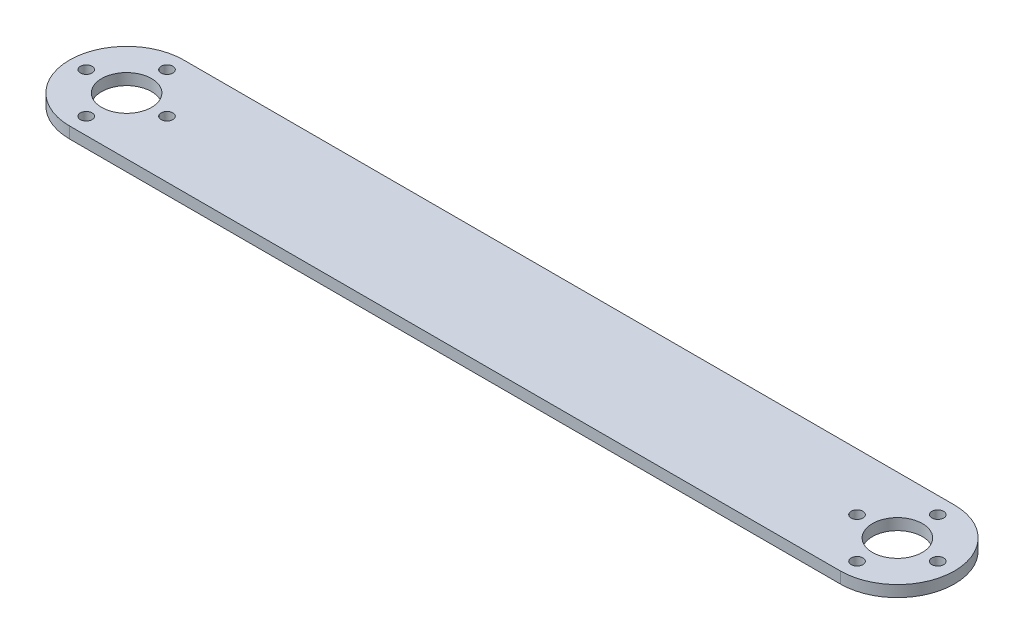
ISO-10303-21;
HEADER;
FILE_DESCRIPTION(('STEP AP214'),'2;1');
FILE_NAME('part.step','',(''),(''),'','','');
FILE_SCHEMA(('AUTOMOTIVE_DESIGN { 1 0 10303 214 1 1 1 1 }'));
ENDSEC;
DATA;
#1=APPLICATION_CONTEXT('core data for automotive mechanical design processes');
#2=APPLICATION_PROTOCOL_DEFINITION('international standard','automotive_design',2000,#1);
#3=PRODUCT_CONTEXT('',#1,'mechanical');
#4=PRODUCT('Part','Part','',(#3));
#5=PRODUCT_RELATED_PRODUCT_CATEGORY('part','',(#4));
#6=PRODUCT_DEFINITION_FORMATION('','',#4);
#7=PRODUCT_DEFINITION_CONTEXT('part definition',#1,'design');
#8=PRODUCT_DEFINITION('design','',#6,#7);
#9=PRODUCT_DEFINITION_SHAPE('','',#8);
#10=(LENGTH_UNIT() NAMED_UNIT(*) SI_UNIT(.MILLI.,.METRE.));
#11=(NAMED_UNIT(*) PLANE_ANGLE_UNIT() SI_UNIT($,.RADIAN.));
#12=(NAMED_UNIT(*) SI_UNIT($,.STERADIAN.) SOLID_ANGLE_UNIT());
#13=UNCERTAINTY_MEASURE_WITH_UNIT(LENGTH_MEASURE(1.E-05),#10,'distance_accuracy_value','');
#14=(GEOMETRIC_REPRESENTATION_CONTEXT(3) GLOBAL_UNCERTAINTY_ASSIGNED_CONTEXT((#13)) GLOBAL_UNIT_ASSIGNED_CONTEXT((#10,
#11,#12)) REPRESENTATION_CONTEXT('',''));
#15=CARTESIAN_POINT('',(0.,0.,0.));
#16=DIRECTION('',(0.,0.,1.));
#17=DIRECTION('',(1.,0.,0.));
#18=AXIS2_PLACEMENT_3D('',#15,#16,#17);
#19=CARTESIAN_POINT('',(0.,3.175,0.));
#20=DIRECTION('',(0.,1.,0.));
#21=DIRECTION('',(0.,0.,1.));
#22=AXIS2_PLACEMENT_3D('',#19,#20,#21);
#23=PLANE('',#22);
#24=CARTESIAN_POINT('',(216.,3.175,-27.3137084989848));
#25=DIRECTION('',(0.,1.,0.));
#26=DIRECTION('',(0.,0.,1.));
#27=AXIS2_PLACEMENT_3D('',#24,#25,#26);
#28=CIRCLE('',#27,1.65000000000002);
#29=CARTESIAN_POINT('',(216.,3.175,-25.6637084989847));
#30=VERTEX_POINT('',#29);
#31=EDGE_CURVE('E217',#30,#30,#28,.F.);
#32=ORIENTED_EDGE('',*,*,#31,.T.);
#33=EDGE_LOOP('',(#32));
#34=FACE_BOUND('',#33,.T.);
#35=CARTESIAN_POINT('',(216.,3.175,-4.68629150101524));
#36=DIRECTION('',(0.,-1.,0.));
#37=DIRECTION('',(0.,0.,-1.));
#38=AXIS2_PLACEMENT_3D('',#35,#36,#37);
#39=CIRCLE('',#38,1.65000000000002);
#40=CARTESIAN_POINT('',(216.,3.175,-6.33629150101525));
#41=VERTEX_POINT('',#40);
#42=EDGE_CURVE('E264',#41,#41,#39,.T.);
#43=ORIENTED_EDGE('',*,*,#42,.T.);
#44=EDGE_LOOP('',(#43));
#45=FACE_BOUND('',#44,.T.);
#46=CARTESIAN_POINT('',(227.313708498985,3.175,-16.));
#47=DIRECTION('',(0.,-1.,0.));
#48=DIRECTION('',(0.,0.,-1.));
#49=AXIS2_PLACEMENT_3D('',#46,#47,#48);
#50=CIRCLE('',#49,1.64999999999999);
#51=CARTESIAN_POINT('',(227.313708498985,3.175,-17.65));
#52=VERTEX_POINT('',#51);
#53=EDGE_CURVE('E267',#52,#52,#50,.T.);
#54=ORIENTED_EDGE('',*,*,#53,.T.);
#55=EDGE_LOOP('',(#54));
#56=FACE_BOUND('',#55,.T.);
#57=CARTESIAN_POINT('',(204.686291501015,3.175,-16.));
#58=DIRECTION('',(0.,1.,0.));
#59=DIRECTION('',(0.,0.,1.));
#60=AXIS2_PLACEMENT_3D('',#57,#58,#59);
#61=CIRCLE('',#60,1.64999999999999);
#62=CARTESIAN_POINT('',(204.686291501015,3.175,-14.35));
#63=VERTEX_POINT('',#62);
#64=EDGE_CURVE('E126',#63,#63,#61,.F.);
#65=ORIENTED_EDGE('',*,*,#64,.T.);
#66=EDGE_LOOP('',(#65));
#67=FACE_BOUND('',#66,.T.);
#68=CARTESIAN_POINT('',(216.,3.175,-16.));
#69=DIRECTION('',(0.,1.,0.));
#70=DIRECTION('',(0.,0.,1.));
#71=AXIS2_PLACEMENT_3D('',#68,#69,#70);
#72=CIRCLE('',#71,16.);
#73=CARTESIAN_POINT('',(216.,3.175,-32.));
#74=VERTEX_POINT('',#73);
#75=CARTESIAN_POINT('',(216.,3.175,0.));
#76=VERTEX_POINT('',#75);
#77=EDGE_CURVE('E95',#74,#76,#72,.F.);
#78=ORIENTED_EDGE('',*,*,#77,.F.);
#79=DIRECTION('',(1.,0.,0.));
#80=VECTOR('',#79,1.);
#81=CARTESIAN_POINT('',(0.,3.175,-32.));
#82=LINE('',#81,#80);
#83=CARTESIAN_POINT('',(0.,3.175,-32.));
#84=VERTEX_POINT('',#83);
#85=EDGE_CURVE('E86',#84,#74,#82,.T.);
#86=ORIENTED_EDGE('',*,*,#85,.F.);
#87=CARTESIAN_POINT('',(0.,3.175,-16.));
#88=DIRECTION('',(0.,1.,0.));
#89=DIRECTION('',(0.,0.,1.));
#90=AXIS2_PLACEMENT_3D('',#87,#88,#89);
#91=CIRCLE('',#90,16.);
#92=CARTESIAN_POINT('',(0.,3.175,0.));
#93=VERTEX_POINT('',#92);
#94=EDGE_CURVE('E91',#84,#93,#91,.T.);
#95=ORIENTED_EDGE('',*,*,#94,.T.);
#96=DIRECTION('',(1.,0.,0.));
#97=VECTOR('',#96,1.);
#98=CARTESIAN_POINT('',(0.,3.175,0.));
#99=LINE('',#98,#97);
#100=EDGE_CURVE('E53',#93,#76,#99,.T.);
#101=ORIENTED_EDGE('',*,*,#100,.T.);
#102=EDGE_LOOP('',(#78,#86,#95,#101));
#103=FACE_BOUND('',#102,.T.);
#104=CARTESIAN_POINT('',(216.,3.175,-16.));
#105=DIRECTION('',(0.,1.,0.));
#106=DIRECTION('',(0.,0.,1.));
#107=AXIS2_PLACEMENT_3D('',#104,#105,#106);
#108=CIRCLE('',#107,7.00000000000001);
#109=CARTESIAN_POINT('',(216.,3.175,-8.99999999999999));
#110=VERTEX_POINT('',#109);
#111=EDGE_CURVE('E102',#110,#110,#108,.T.);
#112=ORIENTED_EDGE('',*,*,#111,.F.);
#113=EDGE_LOOP('',(#112));
#114=FACE_BOUND('',#113,.T.);
#115=CARTESIAN_POINT('',(0.,3.175,-16.));
#116=DIRECTION('',(0.,1.,0.));
#117=DIRECTION('',(0.,0.,1.));
#118=AXIS2_PLACEMENT_3D('',#115,#116,#117);
#119=CIRCLE('',#118,7.);
#120=CARTESIAN_POINT('',(0.,3.175,-9.));
#121=VERTEX_POINT('',#120);
#122=EDGE_CURVE('E105',#121,#121,#119,.T.);
#123=ORIENTED_EDGE('',*,*,#122,.F.);
#124=EDGE_LOOP('',(#123));
#125=FACE_BOUND('',#124,.T.);
#126=CARTESIAN_POINT('',(0.,3.175,-4.68629150101524));
#127=DIRECTION('',(0.,1.,0.));
#128=DIRECTION('',(0.,0.,1.));
#129=AXIS2_PLACEMENT_3D('',#126,#127,#128);
#130=CIRCLE('',#129,1.65);
#131=CARTESIAN_POINT('',(0.,3.175,-3.03629150101524));
#132=VERTEX_POINT('',#131);
#133=EDGE_CURVE('E255',#132,#132,#130,.T.);
#134=ORIENTED_EDGE('',*,*,#133,.F.);
#135=EDGE_LOOP('',(#134));
#136=FACE_BOUND('',#135,.T.);
#137=CARTESIAN_POINT('',(-11.3137084989848,3.175,-16.));
#138=DIRECTION('',(0.,1.,0.));
#139=DIRECTION('',(0.,0.,1.));
#140=AXIS2_PLACEMENT_3D('',#137,#138,#139);
#141=CIRCLE('',#140,1.65);
#142=CARTESIAN_POINT('',(-11.3137084989848,3.175,-14.35));
#143=VERTEX_POINT('',#142);
#144=EDGE_CURVE('E215',#143,#143,#141,.T.);
#145=ORIENTED_EDGE('',*,*,#144,.F.);
#146=EDGE_LOOP('',(#145));
#147=FACE_BOUND('',#146,.T.);
#148=CARTESIAN_POINT('',(0.,3.175,-27.3137084989848));
#149=DIRECTION('',(0.,1.,0.));
#150=DIRECTION('',(0.,0.,1.));
#151=AXIS2_PLACEMENT_3D('',#148,#149,#150);
#152=CIRCLE('',#151,1.65);
#153=CARTESIAN_POINT('',(0.,3.175,-25.6637084989848));
#154=VERTEX_POINT('',#153);
#155=EDGE_CURVE('E218',#154,#154,#152,.T.);
#156=ORIENTED_EDGE('',*,*,#155,.F.);
#157=EDGE_LOOP('',(#156));
#158=FACE_BOUND('',#157,.T.);
#159=CARTESIAN_POINT('',(11.3137084989848,3.175,-16.));
#160=DIRECTION('',(0.,1.,0.));
#161=DIRECTION('',(0.,0.,1.));
#162=AXIS2_PLACEMENT_3D('',#159,#160,#161);
#163=CIRCLE('',#162,1.65);
#164=CARTESIAN_POINT('',(11.3137084989848,3.175,-14.35));
#165=VERTEX_POINT('',#164);
#166=EDGE_CURVE('E222',#165,#165,#163,.T.);
#167=ORIENTED_EDGE('',*,*,#166,.F.);
#168=EDGE_LOOP('',(#167));
#169=FACE_BOUND('',#168,.T.);
#170=ADVANCED_FACE('F34',(#34,#45,#56,#67,#103,#114,#125,#136,#147,#158,#169),#23,.T.);
#171=CARTESIAN_POINT('',(0.,0.,0.));
#172=DIRECTION('',(0.,1.,0.));
#173=DIRECTION('',(0.,0.,1.));
#174=AXIS2_PLACEMENT_3D('',#171,#172,#173);
#175=PLANE('',#174);
#176=CARTESIAN_POINT('',(0.,0.,-27.3137084989848));
#177=DIRECTION('',(0.,1.,0.));
#178=DIRECTION('',(0.,0.,1.));
#179=AXIS2_PLACEMENT_3D('',#176,#177,#178);
#180=CIRCLE('',#179,1.65);
#181=CARTESIAN_POINT('',(0.,0.,-25.6637084989848));
#182=VERTEX_POINT('',#181);
#183=EDGE_CURVE('E140',#182,#182,#180,.T.);
#184=ORIENTED_EDGE('',*,*,#183,.T.);
#185=EDGE_LOOP('',(#184));
#186=FACE_BOUND('',#185,.T.);
#187=CARTESIAN_POINT('',(0.,0.,-4.68629150101524));
#188=DIRECTION('',(0.,1.,0.));
#189=DIRECTION('',(0.,0.,1.));
#190=AXIS2_PLACEMENT_3D('',#187,#188,#189);
#191=CIRCLE('',#190,1.65);
#192=CARTESIAN_POINT('',(0.,0.,-3.03629150101524));
#193=VERTEX_POINT('',#192);
#194=EDGE_CURVE('E132',#193,#193,#191,.T.);
#195=ORIENTED_EDGE('',*,*,#194,.T.);
#196=EDGE_LOOP('',(#195));
#197=FACE_BOUND('',#196,.T.);
#198=CARTESIAN_POINT('',(216.,0.,-4.68629150101524));
#199=DIRECTION('',(0.,1.,0.));
#200=DIRECTION('',(0.,0.,1.));
#201=AXIS2_PLACEMENT_3D('',#198,#199,#200);
#202=CIRCLE('',#201,1.65000000000002);
#203=CARTESIAN_POINT('',(216.,0.,-3.03629150101522));
#204=VERTEX_POINT('',#203);
#205=EDGE_CURVE('E129',#204,#204,#202,.F.);
#206=ORIENTED_EDGE('',*,*,#205,.F.);
#207=EDGE_LOOP('',(#206));
#208=FACE_BOUND('',#207,.T.);
#209=CARTESIAN_POINT('',(227.313708498985,0.,-16.));
#210=DIRECTION('',(0.,1.,0.));
#211=DIRECTION('',(0.,0.,1.));
#212=AXIS2_PLACEMENT_3D('',#209,#210,#211);
#213=CIRCLE('',#212,1.64999999999999);
#214=CARTESIAN_POINT('',(227.313708498985,0.,-14.35));
#215=VERTEX_POINT('',#214);
#216=EDGE_CURVE('E125',#215,#215,#213,.F.);
#217=ORIENTED_EDGE('',*,*,#216,.F.);
#218=EDGE_LOOP('',(#217));
#219=FACE_BOUND('',#218,.T.);
#220=CARTESIAN_POINT('',(204.686291501015,0.,-16.));
#221=DIRECTION('',(0.,1.,0.));
#222=DIRECTION('',(0.,0.,1.));
#223=AXIS2_PLACEMENT_3D('',#220,#221,#222);
#224=CIRCLE('',#223,1.64999999999999);
#225=CARTESIAN_POINT('',(204.686291501015,0.,-14.35));
#226=VERTEX_POINT('',#225);
#227=EDGE_CURVE('E122',#226,#226,#224,.F.);
#228=ORIENTED_EDGE('',*,*,#227,.F.);
#229=EDGE_LOOP('',(#228));
#230=FACE_BOUND('',#229,.T.);
#231=CARTESIAN_POINT('',(216.,0.,-16.));
#232=DIRECTION('',(0.,1.,0.));
#233=DIRECTION('',(0.,0.,1.));
#234=AXIS2_PLACEMENT_3D('',#231,#232,#233);
#235=CIRCLE('',#234,16.);
#236=CARTESIAN_POINT('',(216.,0.,-32.));
#237=VERTEX_POINT('',#236);
#238=CARTESIAN_POINT('',(216.,0.,0.));
#239=VERTEX_POINT('',#238);
#240=EDGE_CURVE('E108',#237,#239,#235,.F.);
#241=ORIENTED_EDGE('',*,*,#240,.T.);
#242=DIRECTION('',(1.,0.,0.));
#243=VECTOR('',#242,1.);
#244=CARTESIAN_POINT('',(0.,0.,0.));
#245=LINE('',#244,#243);
#246=CARTESIAN_POINT('',(0.,0.,0.));
#247=VERTEX_POINT('',#246);
#248=EDGE_CURVE('E113',#247,#239,#245,.T.);
#249=ORIENTED_EDGE('',*,*,#248,.F.);
#250=CARTESIAN_POINT('',(0.,0.,-16.));
#251=DIRECTION('',(0.,1.,0.));
#252=DIRECTION('',(0.,0.,1.));
#253=AXIS2_PLACEMENT_3D('',#250,#251,#252);
#254=CIRCLE('',#253,16.);
#255=CARTESIAN_POINT('',(0.,0.,-32.));
#256=VERTEX_POINT('',#255);
#257=EDGE_CURVE('E68',#256,#247,#254,.T.);
#258=ORIENTED_EDGE('',*,*,#257,.F.);
#259=DIRECTION('',(1.,0.,0.));
#260=VECTOR('',#259,1.);
#261=CARTESIAN_POINT('',(0.,0.,-32.));
#262=LINE('',#261,#260);
#263=EDGE_CURVE('E88',#256,#237,#262,.T.);
#264=ORIENTED_EDGE('',*,*,#263,.T.);
#265=EDGE_LOOP('',(#241,#249,#258,#264));
#266=FACE_BOUND('',#265,.T.);
#267=CARTESIAN_POINT('',(216.,0.,-16.));
#268=DIRECTION('',(0.,1.,0.));
#269=DIRECTION('',(0.,0.,1.));
#270=AXIS2_PLACEMENT_3D('',#267,#268,#269);
#271=CIRCLE('',#270,7.00000000000001);
#272=CARTESIAN_POINT('',(216.,0.,-8.99999999999999));
#273=VERTEX_POINT('',#272);
#274=EDGE_CURVE('E115',#273,#273,#271,.T.);
#275=ORIENTED_EDGE('',*,*,#274,.T.);
#276=EDGE_LOOP('',(#275));
#277=FACE_BOUND('',#276,.T.);
#278=CARTESIAN_POINT('',(0.,0.,-16.));
#279=DIRECTION('',(0.,1.,0.));
#280=DIRECTION('',(0.,0.,1.));
#281=AXIS2_PLACEMENT_3D('',#278,#279,#280);
#282=CIRCLE('',#281,7.);
#283=CARTESIAN_POINT('',(0.,0.,-9.));
#284=VERTEX_POINT('',#283);
#285=EDGE_CURVE('E97',#284,#284,#282,.T.);
#286=ORIENTED_EDGE('',*,*,#285,.T.);
#287=EDGE_LOOP('',(#286));
#288=FACE_BOUND('',#287,.T.);
#289=CARTESIAN_POINT('',(216.,0.,-27.3137084989848));
#290=DIRECTION('',(0.,1.,0.));
#291=DIRECTION('',(0.,0.,1.));
#292=AXIS2_PLACEMENT_3D('',#289,#290,#291);
#293=CIRCLE('',#292,1.65000000000002);
#294=CARTESIAN_POINT('',(216.,0.,-25.6637084989847));
#295=VERTEX_POINT('',#294);
#296=EDGE_CURVE('E135',#295,#295,#293,.F.);
#297=ORIENTED_EDGE('',*,*,#296,.F.);
#298=EDGE_LOOP('',(#297));
#299=FACE_BOUND('',#298,.T.);
#300=CARTESIAN_POINT('',(-11.3137084989848,0.,-16.));
#301=DIRECTION('',(0.,1.,0.));
#302=DIRECTION('',(0.,0.,1.));
#303=AXIS2_PLACEMENT_3D('',#300,#301,#302);
#304=CIRCLE('',#303,1.65);
#305=CARTESIAN_POINT('',(-11.3137084989848,0.,-14.35));
#306=VERTEX_POINT('',#305);
#307=EDGE_CURVE('E138',#306,#306,#304,.T.);
#308=ORIENTED_EDGE('',*,*,#307,.T.);
#309=EDGE_LOOP('',(#308));
#310=FACE_BOUND('',#309,.T.);
#311=CARTESIAN_POINT('',(11.3137084989848,0.,-16.));
#312=DIRECTION('',(0.,1.,0.));
#313=DIRECTION('',(0.,0.,1.));
#314=AXIS2_PLACEMENT_3D('',#311,#312,#313);
#315=CIRCLE('',#314,1.65);
#316=CARTESIAN_POINT('',(11.3137084989848,0.,-14.35));
#317=VERTEX_POINT('',#316);
#318=EDGE_CURVE('E38',#317,#317,#315,.T.);
#319=ORIENTED_EDGE('',*,*,#318,.T.);
#320=EDGE_LOOP('',(#319));
#321=FACE_BOUND('',#320,.T.);
#322=ADVANCED_FACE('F147',(#186,#197,#208,#219,#230,#266,#277,#288,#299,#310,#321),#175,.F.);
#323=CARTESIAN_POINT('',(216.,3.175,-16.));
#324=DIRECTION('',(0.,-1.,0.));
#325=DIRECTION('',(0.,0.,-1.));
#326=AXIS2_PLACEMENT_3D('',#323,#324,#325);
#327=CYLINDRICAL_SURFACE('',#326,16.);
#328=ORIENTED_EDGE('',*,*,#240,.F.);
#329=DIRECTION('',(0.,-1.,0.));
#330=VECTOR('',#329,1.);
#331=CARTESIAN_POINT('',(216.,3.175,-32.));
#332=LINE('',#331,#330);
#333=EDGE_CURVE('E11',#74,#237,#332,.T.);
#334=ORIENTED_EDGE('',*,*,#333,.F.);
#335=ORIENTED_EDGE('',*,*,#77,.T.);
#336=DIRECTION('',(0.,-1.,0.));
#337=VECTOR('',#336,1.);
#338=CARTESIAN_POINT('',(216.,3.175,0.));
#339=LINE('',#338,#337);
#340=EDGE_CURVE('E75',#76,#239,#339,.T.);
#341=ORIENTED_EDGE('',*,*,#340,.T.);
#342=EDGE_LOOP('',(#328,#334,#335,#341));
#343=FACE_BOUND('',#342,.T.);
#344=ADVANCED_FACE('F36',(#343),#327,.T.);
#345=CARTESIAN_POINT('',(0.,3.175,-32.));
#346=DIRECTION('',(0.,0.,-1.));
#347=DIRECTION('',(-1.,0.,0.));
#348=AXIS2_PLACEMENT_3D('',#345,#346,#347);
#349=PLANE('',#348);
#350=ORIENTED_EDGE('',*,*,#263,.F.);
#351=DIRECTION('',(0.,-1.,0.));
#352=VECTOR('',#351,1.);
#353=CARTESIAN_POINT('',(0.,3.175,-32.));
#354=LINE('',#353,#352);
#355=EDGE_CURVE('E44',#84,#256,#354,.T.);
#356=ORIENTED_EDGE('',*,*,#355,.F.);
#357=ORIENTED_EDGE('',*,*,#85,.T.);
#358=ORIENTED_EDGE('',*,*,#333,.T.);
#359=EDGE_LOOP('',(#350,#356,#357,#358));
#360=FACE_BOUND('',#359,.T.);
#361=ADVANCED_FACE('F84',(#360),#349,.T.);
#362=CARTESIAN_POINT('',(0.,3.175,-16.));
#363=DIRECTION('',(0.,-1.,0.));
#364=DIRECTION('',(0.,0.,-1.));
#365=AXIS2_PLACEMENT_3D('',#362,#363,#364);
#366=CYLINDRICAL_SURFACE('',#365,16.);
#367=ORIENTED_EDGE('',*,*,#257,.T.);
#368=DIRECTION('',(0.,-1.,0.));
#369=VECTOR('',#368,1.);
#370=CARTESIAN_POINT('',(0.,3.175,0.));
#371=LINE('',#370,#369);
#372=EDGE_CURVE('E89',#93,#247,#371,.T.);
#373=ORIENTED_EDGE('',*,*,#372,.F.);
#374=ORIENTED_EDGE('',*,*,#94,.F.);
#375=ORIENTED_EDGE('',*,*,#355,.T.);
#376=EDGE_LOOP('',(#367,#373,#374,#375));
#377=FACE_BOUND('',#376,.T.);
#378=ADVANCED_FACE('F92',(#377),#366,.T.);
#379=CARTESIAN_POINT('',(216.,3.175,-16.));
#380=DIRECTION('',(0.,-1.,0.));
#381=DIRECTION('',(0.,0.,-1.));
#382=AXIS2_PLACEMENT_3D('',#379,#380,#381);
#383=CYLINDRICAL_SURFACE('',#382,7.00000000000001);
#384=ORIENTED_EDGE('',*,*,#111,.T.);
#385=EDGE_LOOP('',(#384));
#386=FACE_BOUND('',#385,.T.);
#387=ORIENTED_EDGE('',*,*,#274,.F.);
#388=EDGE_LOOP('',(#387));
#389=FACE_BOUND('',#388,.T.);
#390=ADVANCED_FACE('F180',(#386,#389),#383,.F.);
#391=CARTESIAN_POINT('',(0.,3.175,0.));
#392=DIRECTION('',(0.,0.,-1.));
#393=DIRECTION('',(-1.,0.,0.));
#394=AXIS2_PLACEMENT_3D('',#391,#392,#393);
#395=PLANE('',#394);
#396=ORIENTED_EDGE('',*,*,#248,.T.);
#397=ORIENTED_EDGE('',*,*,#340,.F.);
#398=ORIENTED_EDGE('',*,*,#100,.F.);
#399=ORIENTED_EDGE('',*,*,#372,.T.);
#400=EDGE_LOOP('',(#396,#397,#398,#399));
#401=FACE_BOUND('',#400,.T.);
#402=ADVANCED_FACE('F178',(#401),#395,.F.);
#403=CARTESIAN_POINT('',(0.,3.175,-16.));
#404=DIRECTION('',(0.,-1.,0.));
#405=DIRECTION('',(0.,0.,-1.));
#406=AXIS2_PLACEMENT_3D('',#403,#404,#405);
#407=CYLINDRICAL_SURFACE('',#406,7.);
#408=ORIENTED_EDGE('',*,*,#122,.T.);
#409=EDGE_LOOP('',(#408));
#410=FACE_BOUND('',#409,.T.);
#411=ORIENTED_EDGE('',*,*,#285,.F.);
#412=EDGE_LOOP('',(#411));
#413=FACE_BOUND('',#412,.T.);
#414=ADVANCED_FACE('F175',(#410,#413),#407,.F.);
#415=CARTESIAN_POINT('',(204.686291501015,-6.825,-16.));
#416=DIRECTION('',(0.,1.,0.));
#417=DIRECTION('',(0.,0.,1.));
#418=AXIS2_PLACEMENT_3D('',#415,#416,#417);
#419=CYLINDRICAL_SURFACE('',#418,1.64999999999999);
#420=ORIENTED_EDGE('',*,*,#64,.F.);
#421=EDGE_LOOP('',(#420));
#422=FACE_BOUND('',#421,.T.);
#423=ORIENTED_EDGE('',*,*,#227,.T.);
#424=EDGE_LOOP('',(#423));
#425=FACE_BOUND('',#424,.T.);
#426=ADVANCED_FACE('F172',(#422,#425),#419,.F.);
#427=CARTESIAN_POINT('',(227.313708498985,-6.825,-16.));
#428=DIRECTION('',(0.,1.,0.));
#429=DIRECTION('',(0.,0.,1.));
#430=AXIS2_PLACEMENT_3D('',#427,#428,#429);
#431=CYLINDRICAL_SURFACE('',#430,1.64999999999999);
#432=ORIENTED_EDGE('',*,*,#53,.F.);
#433=EDGE_LOOP('',(#432));
#434=FACE_BOUND('',#433,.T.);
#435=ORIENTED_EDGE('',*,*,#216,.T.);
#436=EDGE_LOOP('',(#435));
#437=FACE_BOUND('',#436,.T.);
#438=ADVANCED_FACE('F231',(#434,#437),#431,.F.);
#439=CARTESIAN_POINT('',(216.,-6.825,-4.68629150101524));
#440=DIRECTION('',(0.,1.,0.));
#441=DIRECTION('',(0.,0.,1.));
#442=AXIS2_PLACEMENT_3D('',#439,#440,#441);
#443=CYLINDRICAL_SURFACE('',#442,1.65000000000002);
#444=ORIENTED_EDGE('',*,*,#42,.F.);
#445=EDGE_LOOP('',(#444));
#446=FACE_BOUND('',#445,.T.);
#447=ORIENTED_EDGE('',*,*,#205,.T.);
#448=EDGE_LOOP('',(#447));
#449=FACE_BOUND('',#448,.T.);
#450=ADVANCED_FACE('F237',(#446,#449),#443,.F.);
#451=CARTESIAN_POINT('',(0.,-6.825,-4.68629150101524));
#452=DIRECTION('',(0.,1.,0.));
#453=DIRECTION('',(0.,0.,1.));
#454=AXIS2_PLACEMENT_3D('',#451,#452,#453);
#455=CYLINDRICAL_SURFACE('',#454,1.65);
#456=ORIENTED_EDGE('',*,*,#133,.T.);
#457=EDGE_LOOP('',(#456));
#458=FACE_BOUND('',#457,.T.);
#459=ORIENTED_EDGE('',*,*,#194,.F.);
#460=EDGE_LOOP('',(#459));
#461=FACE_BOUND('',#460,.T.);
#462=ADVANCED_FACE('F211',(#458,#461),#455,.F.);
#463=CARTESIAN_POINT('',(216.,-6.825,-27.3137084989848));
#464=DIRECTION('',(0.,1.,0.));
#465=DIRECTION('',(0.,0.,1.));
#466=AXIS2_PLACEMENT_3D('',#463,#464,#465);
#467=CYLINDRICAL_SURFACE('',#466,1.65000000000002);
#468=ORIENTED_EDGE('',*,*,#31,.F.);
#469=EDGE_LOOP('',(#468));
#470=FACE_BOUND('',#469,.T.);
#471=ORIENTED_EDGE('',*,*,#296,.T.);
#472=EDGE_LOOP('',(#471));
#473=FACE_BOUND('',#472,.T.);
#474=ADVANCED_FACE('F206',(#470,#473),#467,.F.);
#475=CARTESIAN_POINT('',(-11.3137084989848,-6.825,-16.));
#476=DIRECTION('',(0.,1.,0.));
#477=DIRECTION('',(0.,0.,1.));
#478=AXIS2_PLACEMENT_3D('',#475,#476,#477);
#479=CYLINDRICAL_SURFACE('',#478,1.65);
#480=ORIENTED_EDGE('',*,*,#144,.T.);
#481=EDGE_LOOP('',(#480));
#482=FACE_BOUND('',#481,.T.);
#483=ORIENTED_EDGE('',*,*,#307,.F.);
#484=EDGE_LOOP('',(#483));
#485=FACE_BOUND('',#484,.T.);
#486=ADVANCED_FACE('F157',(#482,#485),#479,.F.);
#487=CARTESIAN_POINT('',(0.,-6.825,-27.3137084989848));
#488=DIRECTION('',(0.,1.,0.));
#489=DIRECTION('',(0.,0.,1.));
#490=AXIS2_PLACEMENT_3D('',#487,#488,#489);
#491=CYLINDRICAL_SURFACE('',#490,1.65);
#492=ORIENTED_EDGE('',*,*,#155,.T.);
#493=EDGE_LOOP('',(#492));
#494=FACE_BOUND('',#493,.T.);
#495=ORIENTED_EDGE('',*,*,#183,.F.);
#496=EDGE_LOOP('',(#495));
#497=FACE_BOUND('',#496,.T.);
#498=ADVANCED_FACE('F151',(#494,#497),#491,.F.);
#499=CARTESIAN_POINT('',(11.3137084989848,-6.825,-16.));
#500=DIRECTION('',(0.,1.,0.));
#501=DIRECTION('',(0.,0.,1.));
#502=AXIS2_PLACEMENT_3D('',#499,#500,#501);
#503=CYLINDRICAL_SURFACE('',#502,1.65);
#504=ORIENTED_EDGE('',*,*,#166,.T.);
#505=EDGE_LOOP('',(#504));
#506=FACE_BOUND('',#505,.T.);
#507=ORIENTED_EDGE('',*,*,#318,.F.);
#508=EDGE_LOOP('',(#507));
#509=FACE_BOUND('',#508,.T.);
#510=ADVANCED_FACE('F149',(#506,#509),#503,.F.);
#511=CLOSED_SHELL('',(#170,#322,#344,#361,#378,#390,#402,#414,#426,#438,#450,#462,#474,#486,
#498,#510));
#512=MANIFOLD_SOLID_BREP('B2',#511);
#513=ADVANCED_BREP_SHAPE_REPRESENTATION('',(#18,#512),#14);
#514=SHAPE_DEFINITION_REPRESENTATION(#9,#513);
ENDSEC;
END-ISO-10303-21;
